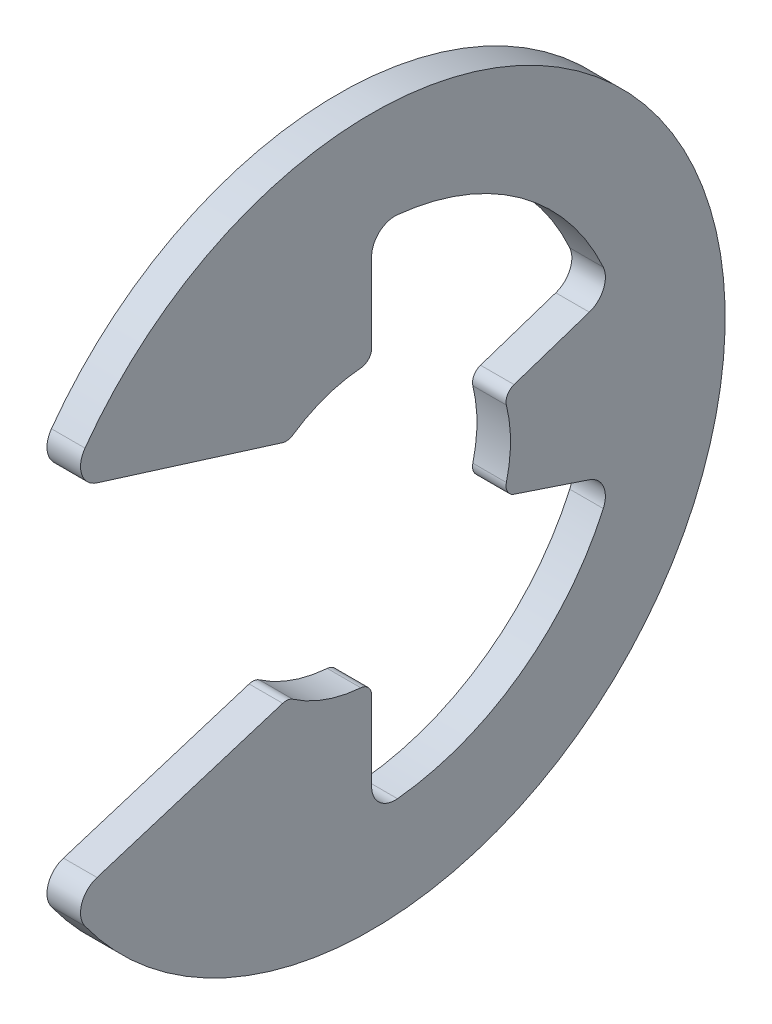
ISO-10303-21;
HEADER;
FILE_DESCRIPTION(('STEP AP214'),'2;1');
FILE_NAME('part.step','',(''),(''),'','','');
FILE_SCHEMA(('AUTOMOTIVE_DESIGN { 1 0 10303 214 1 1 1 1 }'));
ENDSEC;
DATA;
#1=APPLICATION_CONTEXT('core data for automotive mechanical design processes');
#2=APPLICATION_PROTOCOL_DEFINITION('international standard','automotive_design',2000,#1);
#3=PRODUCT_CONTEXT('',#1,'mechanical');
#4=PRODUCT('Part','Part','',(#3));
#5=PRODUCT_RELATED_PRODUCT_CATEGORY('part','',(#4));
#6=PRODUCT_DEFINITION_FORMATION('','',#4);
#7=PRODUCT_DEFINITION_CONTEXT('part definition',#1,'design');
#8=PRODUCT_DEFINITION('design','',#6,#7);
#9=PRODUCT_DEFINITION_SHAPE('','',#8);
#10=(LENGTH_UNIT() NAMED_UNIT(*) SI_UNIT(.MILLI.,.METRE.));
#11=(NAMED_UNIT(*) PLANE_ANGLE_UNIT() SI_UNIT($,.RADIAN.));
#12=(NAMED_UNIT(*) SI_UNIT($,.STERADIAN.) SOLID_ANGLE_UNIT());
#13=UNCERTAINTY_MEASURE_WITH_UNIT(LENGTH_MEASURE(1.E-05),#10,'distance_accuracy_value','');
#14=(GEOMETRIC_REPRESENTATION_CONTEXT(3) GLOBAL_UNCERTAINTY_ASSIGNED_CONTEXT((#13)) GLOBAL_UNIT_ASSIGNED_CONTEXT((#10,
#11,#12)) REPRESENTATION_CONTEXT('',''));
#15=CARTESIAN_POINT('',(0.,0.,0.));
#16=DIRECTION('',(0.,0.,1.));
#17=DIRECTION('',(1.,0.,0.));
#18=AXIS2_PLACEMENT_3D('',#15,#16,#17);
#19=CARTESIAN_POINT('',(0.3175,0.,0.));
#20=DIRECTION('',(-1.,0.,0.));
#21=DIRECTION('',(0.,0.,1.));
#22=AXIS2_PLACEMENT_3D('',#19,#20,#21);
#23=CYLINDRICAL_SURFACE('',#22,2.6289);
#24=CARTESIAN_POINT('',(0.3175,0.,0.));
#25=DIRECTION('',(-1.,0.,0.));
#26=DIRECTION('',(0.,0.,-1.));
#27=AXIS2_PLACEMENT_3D('',#24,#25,#26);
#28=CIRCLE('',#27,2.6289);
#29=CARTESIAN_POINT('',(0.3175,0.634392297731757,-2.55120787521884));
#30=VERTEX_POINT('',#29);
#31=CARTESIAN_POINT('',(0.3175,-0.634392297731756,-2.55120787521884));
#32=VERTEX_POINT('',#31);
#33=EDGE_CURVE('E316',#30,#32,#28,.T.);
#34=ORIENTED_EDGE('',*,*,#33,.F.);
#35=DIRECTION('',(-1.,0.,0.));
#36=VECTOR('',#35,1.);
#37=CARTESIAN_POINT('',(0.3175,0.634392297731757,-2.55120787521884));
#38=LINE('',#37,#36);
#39=CARTESIAN_POINT('',(-0.3175,0.634392297731757,-2.55120787521884));
#40=VERTEX_POINT('',#39);
#41=EDGE_CURVE('E484',#30,#40,#38,.T.);
#42=ORIENTED_EDGE('',*,*,#41,.T.);
#43=CARTESIAN_POINT('',(-0.3175,0.,0.));
#44=DIRECTION('',(-1.,0.,0.));
#45=DIRECTION('',(0.,0.,-1.));
#46=AXIS2_PLACEMENT_3D('',#43,#44,#45);
#47=CIRCLE('',#46,2.6289);
#48=CARTESIAN_POINT('',(-0.3175,-0.634392297731756,-2.55120787521884));
#49=VERTEX_POINT('',#48);
#50=EDGE_CURVE('E550',#40,#49,#47,.T.);
#51=ORIENTED_EDGE('',*,*,#50,.T.);
#52=DIRECTION('',(-1.,0.,0.));
#53=VECTOR('',#52,1.);
#54=CARTESIAN_POINT('',(0.3175,-0.634392297731757,-2.55120787521884));
#55=LINE('',#54,#53);
#56=EDGE_CURVE('E76',#49,#32,#55,.F.);
#57=ORIENTED_EDGE('',*,*,#56,.T.);
#58=EDGE_LOOP('',(#34,#42,#51,#57));
#59=FACE_BOUND('',#58,.T.);
#60=ADVANCED_FACE('F47',(#59),#23,.F.);
#61=CARTESIAN_POINT('',(0.3175,-0.831331174081665,-2.493993522245));
#62=DIRECTION('',(0.,0.948683298050514,-0.316227766016838));
#63=DIRECTION('',(0.,0.316227766016838,0.948683298050514));
#64=AXIS2_PLACEMENT_3D('',#61,#62,#63);
#65=PLANE('',#64);
#66=DIRECTION('',(0.,-0.316227766016838,-0.948683298050514));
#67=VECTOR('',#66,1.);
#68=CARTESIAN_POINT('',(0.3175,-0.831331174081665,-2.493993522245));
#69=LINE('',#68,#67);
#70=CARTESIAN_POINT('',(0.3175,-0.898869359807086,-2.69660807942126));
#71=VERTEX_POINT('',#70);
#72=CARTESIAN_POINT('',(0.3175,-1.37371537804572,-4.12114613413716));
#73=VERTEX_POINT('',#72);
#74=EDGE_CURVE('E325',#71,#73,#69,.T.);
#75=ORIENTED_EDGE('',*,*,#74,.F.);
#76=DIRECTION('',(-1.,0.,0.));
#77=VECTOR('',#76,1.);
#78=CARTESIAN_POINT('',(0.3175,-0.898869359807086,-2.69660807942126));
#79=LINE('',#78,#77);
#80=CARTESIAN_POINT('',(-0.3175,-0.898869359807086,-2.69660807942126));
#81=VERTEX_POINT('',#80);
#82=EDGE_CURVE('E490',#71,#81,#79,.T.);
#83=ORIENTED_EDGE('',*,*,#82,.T.);
#84=DIRECTION('',(0.,-0.316227766016838,-0.948683298050514));
#85=VECTOR('',#84,1.);
#86=CARTESIAN_POINT('',(-0.3175,-0.831331174081665,-2.493993522245));
#87=LINE('',#86,#85);
#88=CARTESIAN_POINT('',(-0.3175,-1.37371537804572,-4.12114613413716));
#89=VERTEX_POINT('',#88);
#90=EDGE_CURVE('E553',#81,#89,#87,.T.);
#91=ORIENTED_EDGE('',*,*,#90,.T.);
#92=DIRECTION('',(1.,0.,0.));
#93=VECTOR('',#92,1.);
#94=CARTESIAN_POINT('',(0.3175,-1.37371537804572,-4.12114613413716));
#95=LINE('',#94,#93);
#96=EDGE_CURVE('E387',#89,#73,#95,.T.);
#97=ORIENTED_EDGE('',*,*,#96,.T.);
#98=EDGE_LOOP('',(#75,#83,#91,#97));
#99=FACE_BOUND('',#98,.T.);
#100=ADVANCED_FACE('F591',(#99),#65,.F.);
#101=CARTESIAN_POINT('',(0.3175,0.,0.));
#102=DIRECTION('',(-1.,0.,0.));
#103=DIRECTION('',(0.,0.,1.));
#104=AXIS2_PLACEMENT_3D('',#101,#102,#103);
#105=CYLINDRICAL_SURFACE('',#104,4.81125161290323);
#106=CARTESIAN_POINT('',(-0.3175,0.,0.));
#107=DIRECTION('',(-1.,0.,0.));
#108=DIRECTION('',(0.,0.,-1.));
#109=AXIS2_PLACEMENT_3D('',#106,#107,#108);
#110=CIRCLE('',#109,4.81125161290323);
#111=CARTESIAN_POINT('',(-0.3175,-1.97816282406592,-4.38577403933986));
#112=VERTEX_POINT('',#111);
#113=CARTESIAN_POINT('',(-0.3175,-4.78626059081718,-0.489746505300684));
#114=VERTEX_POINT('',#113);
#115=EDGE_CURVE('E554',#112,#114,#110,.T.);
#116=ORIENTED_EDGE('',*,*,#115,.T.);
#117=DIRECTION('',(-1.,0.,0.));
#118=VECTOR('',#117,1.);
#119=CARTESIAN_POINT('',(0.3175,-4.78626059081718,-0.489746505300684));
#120=LINE('',#119,#118);
#121=CARTESIAN_POINT('',(0.3175,-4.78626059081718,-0.489746505300684));
#122=VERTEX_POINT('',#121);
#123=EDGE_CURVE('E384',#114,#122,#120,.F.);
#124=ORIENTED_EDGE('',*,*,#123,.T.);
#125=CARTESIAN_POINT('',(0.3175,0.,0.));
#126=DIRECTION('',(-1.,0.,0.));
#127=DIRECTION('',(0.,0.,-1.));
#128=AXIS2_PLACEMENT_3D('',#125,#126,#127);
#129=CIRCLE('',#128,4.81125161290323);
#130=CARTESIAN_POINT('',(0.3175,-1.97816282406592,-4.38577403933986));
#131=VERTEX_POINT('',#130);
#132=EDGE_CURVE('E323',#131,#122,#129,.T.);
#133=ORIENTED_EDGE('',*,*,#132,.F.);
#134=DIRECTION('',(-1.,0.,0.));
#135=VECTOR('',#134,1.);
#136=CARTESIAN_POINT('',(0.3175,-1.97816282406592,-4.38577403933986));
#137=LINE('',#136,#135);
#138=EDGE_CURVE('E378',#131,#112,#137,.T.);
#139=ORIENTED_EDGE('',*,*,#138,.T.);
#140=EDGE_LOOP('',(#116,#124,#133,#139));
#141=FACE_BOUND('',#140,.T.);
#142=ADVANCED_FACE('F596',(#141),#105,.F.);
#143=CARTESIAN_POINT('',(0.3175,-4.81125161290323,0.));
#144=DIRECTION('',(0.,0.,1.));
#145=DIRECTION('',(0.,-1.,0.));
#146=AXIS2_PLACEMENT_3D('',#143,#144,#145);
#147=PLANE('',#146);
#148=DIRECTION('',(0.,1.,0.));
#149=VECTOR('',#148,1.);
#150=CARTESIAN_POINT('',(-0.3175,-4.81125161290323,0.));
#151=LINE('',#150,#149);
#152=CARTESIAN_POINT('',(-0.3175,-4.34406945142374,0.));
#153=VERTEX_POINT('',#152);
#154=CARTESIAN_POINT('',(-0.3175,-2.8424744959278,0.));
#155=VERTEX_POINT('',#154);
#156=EDGE_CURVE('E561',#153,#155,#151,.T.);
#157=ORIENTED_EDGE('',*,*,#156,.T.);
#158=DIRECTION('',(-1.,0.,0.));
#159=VECTOR('',#158,1.);
#160=CARTESIAN_POINT('',(0.3175,-2.8424744959278,0.));
#161=LINE('',#160,#159);
#162=CARTESIAN_POINT('',(0.3175,-2.8424744959278,0.));
#163=VERTEX_POINT('',#162);
#164=EDGE_CURVE('E457',#155,#163,#161,.F.);
#165=ORIENTED_EDGE('',*,*,#164,.T.);
#166=DIRECTION('',(0.,1.,0.));
#167=VECTOR('',#166,1.);
#168=CARTESIAN_POINT('',(0.3175,-4.81125161290323,0.));
#169=LINE('',#168,#167);
#170=CARTESIAN_POINT('',(0.3175,-4.34406945142374,0.));
#171=VERTEX_POINT('',#170);
#172=EDGE_CURVE('E329',#171,#163,#169,.T.);
#173=ORIENTED_EDGE('',*,*,#172,.F.);
#174=DIRECTION('',(1.,0.,0.));
#175=VECTOR('',#174,1.);
#176=CARTESIAN_POINT('',(-0.3175,-4.34406945142374,0.));
#177=LINE('',#176,#175);
#178=EDGE_CURVE('E374',#171,#153,#177,.F.);
#179=ORIENTED_EDGE('',*,*,#178,.T.);
#180=EDGE_LOOP('',(#157,#165,#173,#179));
#181=FACE_BOUND('',#180,.T.);
#182=ADVANCED_FACE('F601',(#181),#147,.F.);
#183=CARTESIAN_POINT('',(0.3175,0.,0.));
#184=DIRECTION('',(-1.,0.,0.));
#185=DIRECTION('',(0.,0.,1.));
#186=AXIS2_PLACEMENT_3D('',#183,#184,#185);
#187=CYLINDRICAL_SURFACE('',#186,2.6289);
#188=CARTESIAN_POINT('',(0.3175,0.,0.));
#189=DIRECTION('',(-1.,0.,0.));
#190=DIRECTION('',(0.,0.,-1.));
#191=AXIS2_PLACEMENT_3D('',#188,#189,#190);
#192=CIRCLE('',#191,2.6289);
#193=CARTESIAN_POINT('',(0.3175,-2.62090076016505,0.204925389755011));
#194=VERTEX_POINT('',#193);
#195=CARTESIAN_POINT('',(0.3175,-2.16527043809185,1.490878646948));
#196=VERTEX_POINT('',#195);
#197=EDGE_CURVE('E331',#194,#196,#192,.T.);
#198=ORIENTED_EDGE('',*,*,#197,.F.);
#199=DIRECTION('',(-1.,0.,0.));
#200=VECTOR('',#199,1.);
#201=CARTESIAN_POINT('',(0.3175,-2.62090076016505,0.204925389755011));
#202=LINE('',#201,#200);
#203=CARTESIAN_POINT('',(-0.3175,-2.62090076016505,0.204925389755011));
#204=VERTEX_POINT('',#203);
#205=EDGE_CURVE('E432',#194,#204,#202,.T.);
#206=ORIENTED_EDGE('',*,*,#205,.T.);
#207=CARTESIAN_POINT('',(-0.3175,0.,0.));
#208=DIRECTION('',(-1.,0.,0.));
#209=DIRECTION('',(0.,0.,-1.));
#210=AXIS2_PLACEMENT_3D('',#207,#208,#209);
#211=CIRCLE('',#210,2.6289);
#212=CARTESIAN_POINT('',(-0.3175,-2.16527043809185,1.490878646948));
#213=VERTEX_POINT('',#212);
#214=EDGE_CURVE('E301',#204,#213,#211,.T.);
#215=ORIENTED_EDGE('',*,*,#214,.T.);
#216=DIRECTION('',(-1.,0.,0.));
#217=VECTOR('',#216,1.);
#218=CARTESIAN_POINT('',(0.3175,-2.16527043809185,1.490878646948));
#219=LINE('',#218,#217);
#220=EDGE_CURVE('E431',#213,#196,#219,.F.);
#221=ORIENTED_EDGE('',*,*,#220,.T.);
#222=EDGE_LOOP('',(#198,#206,#215,#221));
#223=FACE_BOUND('',#222,.T.);
#224=ADVANCED_FACE('F569',(#223),#187,.F.);
#225=CARTESIAN_POINT('',(0.3175,-2.10312,1.57734));
#226=DIRECTION('',(0.,-0.954513538836349,-0.29816757734219));
#227=DIRECTION('',(0.,0.29816757734219,-0.954513538836349));
#228=AXIS2_PLACEMENT_3D('',#225,#226,#227);
#229=PLANE('',#228);
#230=DIRECTION('',(0.,-0.29816757734219,0.954513538836348));
#231=VECTOR('',#230,1.);
#232=CARTESIAN_POINT('',(0.3175,-2.10312,1.57734));
#233=LINE('',#232,#231);
#234=CARTESIAN_POINT('',(0.3175,-2.13618406817537,1.683186856334));
#235=VERTEX_POINT('',#234);
#236=CARTESIAN_POINT('',(0.3175,-3.2341191064352,5.19796826926775));
#237=VERTEX_POINT('',#236);
#238=EDGE_CURVE('E340',#235,#237,#233,.T.);
#239=ORIENTED_EDGE('',*,*,#238,.F.);
#240=DIRECTION('',(-1.,0.,0.));
#241=VECTOR('',#240,1.);
#242=CARTESIAN_POINT('',(0.3175,-2.13618406817537,1.683186856334));
#243=LINE('',#242,#241);
#244=CARTESIAN_POINT('',(-0.3175,-2.13618406817537,1.683186856334));
#245=VERTEX_POINT('',#244);
#246=EDGE_CURVE('E477',#235,#245,#243,.T.);
#247=ORIENTED_EDGE('',*,*,#246,.T.);
#248=DIRECTION('',(0.,-0.29816757734219,0.954513538836348));
#249=VECTOR('',#248,1.);
#250=CARTESIAN_POINT('',(-0.3175,-2.10312,1.57734));
#251=LINE('',#250,#249);
#252=CARTESIAN_POINT('',(-0.3175,-3.2341191064352,5.19796826926775));
#253=VERTEX_POINT('',#252);
#254=EDGE_CURVE('E293',#245,#253,#251,.T.);
#255=ORIENTED_EDGE('',*,*,#254,.T.);
#256=DIRECTION('',(-1.,0.,0.));
#257=VECTOR('',#256,1.);
#258=CARTESIAN_POINT('',(0.3175,-3.2341191064352,5.19796826926775));
#259=LINE('',#258,#257);
#260=EDGE_CURVE('E266',#253,#237,#259,.F.);
#261=ORIENTED_EDGE('',*,*,#260,.T.);
#262=EDGE_LOOP('',(#239,#247,#255,#261));
#263=FACE_BOUND('',#262,.T.);
#264=ADVANCED_FACE('F579',(#263),#229,.F.);
#265=CARTESIAN_POINT('',(0.3175,0.,0.));
#266=DIRECTION('',(-1.,0.,0.));
#267=DIRECTION('',(0.,0.,1.));
#268=AXIS2_PLACEMENT_3D('',#265,#266,#267);
#269=CYLINDRICAL_SURFACE('',#268,6.6929);
#270=CARTESIAN_POINT('',(0.3175,0.,0.));
#271=DIRECTION('',(1.,0.,0.));
#272=DIRECTION('',(0.,0.,-1.));
#273=AXIS2_PLACEMENT_3D('',#270,#271,#272);
#274=CIRCLE('',#273,6.6929);
#275=CARTESIAN_POINT('',(0.3175,-3.91865243360584,5.42577860906571));
#276=VERTEX_POINT('',#275);
#277=CARTESIAN_POINT('',(0.3175,3.91865243360584,5.42577860906571));
#278=VERTEX_POINT('',#277);
#279=EDGE_CURVE('E285',#276,#278,#274,.T.);
#280=ORIENTED_EDGE('',*,*,#279,.F.);
#281=DIRECTION('',(-1.,0.,0.));
#282=VECTOR('',#281,1.);
#283=CARTESIAN_POINT('',(0.3175,-3.91865243360584,5.42577860906571));
#284=LINE('',#283,#282);
#285=CARTESIAN_POINT('',(-0.3175,-3.91865243360584,5.42577860906571));
#286=VERTEX_POINT('',#285);
#287=EDGE_CURVE('E268',#276,#286,#284,.T.);
#288=ORIENTED_EDGE('',*,*,#287,.T.);
#289=CARTESIAN_POINT('',(-0.3175,0.,0.));
#290=DIRECTION('',(1.,0.,0.));
#291=DIRECTION('',(0.,0.,-1.));
#292=AXIS2_PLACEMENT_3D('',#289,#290,#291);
#293=CIRCLE('',#292,6.6929);
#294=CARTESIAN_POINT('',(-0.3175,3.91865243360584,5.42577860906571));
#295=VERTEX_POINT('',#294);
#296=EDGE_CURVE('E276',#286,#295,#293,.T.);
#297=ORIENTED_EDGE('',*,*,#296,.T.);
#298=DIRECTION('',(-1.,0.,0.));
#299=VECTOR('',#298,1.);
#300=CARTESIAN_POINT('',(0.3175,3.91865243360584,5.42577860906571));
#301=LINE('',#300,#299);
#302=EDGE_CURVE('E284',#295,#278,#301,.F.);
#303=ORIENTED_EDGE('',*,*,#302,.T.);
#304=EDGE_LOOP('',(#280,#288,#297,#303));
#305=FACE_BOUND('',#304,.T.);
#306=ADVANCED_FACE('F279',(#305),#269,.T.);
#307=CARTESIAN_POINT('',(0.3175,3.40948689870738,5.75936710911388));
#308=DIRECTION('',(0.,0.954513538836349,-0.298167577342189));
#309=DIRECTION('',(0.,0.298167577342189,0.954513538836349));
#310=AXIS2_PLACEMENT_3D('',#307,#308,#309);
#311=PLANE('',#310);
#312=DIRECTION('',(0.,-0.298167577342189,-0.954513538836349));
#313=VECTOR('',#312,1.);
#314=CARTESIAN_POINT('',(-0.3175,3.40948689870738,5.75936710911388));
#315=LINE('',#314,#313);
#316=CARTESIAN_POINT('',(-0.3175,3.2341191064352,5.19796826926775));
#317=VERTEX_POINT('',#316);
#318=CARTESIAN_POINT('',(-0.3175,2.13618406817537,1.683186856334));
#319=VERTEX_POINT('',#318);
#320=EDGE_CURVE('E288',#317,#319,#315,.T.);
#321=ORIENTED_EDGE('',*,*,#320,.T.);
#322=DIRECTION('',(-1.,0.,0.));
#323=VECTOR('',#322,1.);
#324=CARTESIAN_POINT('',(0.3175,2.13618406817537,1.683186856334));
#325=LINE('',#324,#323);
#326=CARTESIAN_POINT('',(0.3175,2.13618406817537,1.683186856334));
#327=VERTEX_POINT('',#326);
#328=EDGE_CURVE('E59',#319,#327,#325,.F.);
#329=ORIENTED_EDGE('',*,*,#328,.T.);
#330=DIRECTION('',(0.,-0.298167577342189,-0.954513538836349));
#331=VECTOR('',#330,1.);
#332=CARTESIAN_POINT('',(0.3175,3.40948689870738,5.75936710911388));
#333=LINE('',#332,#331);
#334=CARTESIAN_POINT('',(0.3175,3.2341191064352,5.19796826926775));
#335=VERTEX_POINT('',#334);
#336=EDGE_CURVE('E345',#335,#327,#333,.T.);
#337=ORIENTED_EDGE('',*,*,#336,.F.);
#338=DIRECTION('',(-1.,0.,0.));
#339=VECTOR('',#338,1.);
#340=CARTESIAN_POINT('',(0.3175,3.2341191064352,5.19796826926775));
#341=LINE('',#340,#339);
#342=EDGE_CURVE('E371',#335,#317,#341,.T.);
#343=ORIENTED_EDGE('',*,*,#342,.T.);
#344=EDGE_LOOP('',(#321,#329,#337,#343));
#345=FACE_BOUND('',#344,.T.);
#346=ADVANCED_FACE('F502',(#345),#311,.F.);
#347=CARTESIAN_POINT('',(0.3175,0.,0.));
#348=DIRECTION('',(-1.,0.,0.));
#349=DIRECTION('',(0.,0.,1.));
#350=AXIS2_PLACEMENT_3D('',#347,#348,#349);
#351=CYLINDRICAL_SURFACE('',#350,2.6289);
#352=CARTESIAN_POINT('',(0.3175,0.,0.));
#353=DIRECTION('',(-1.,0.,0.));
#354=DIRECTION('',(0.,0.,-1.));
#355=AXIS2_PLACEMENT_3D('',#352,#353,#354);
#356=CIRCLE('',#355,2.6289);
#357=CARTESIAN_POINT('',(0.3175,2.16527043809185,1.49087864694801));
#358=VERTEX_POINT('',#357);
#359=CARTESIAN_POINT('',(0.3175,2.62090076016505,0.204925389755012));
#360=VERTEX_POINT('',#359);
#361=EDGE_CURVE('E347',#358,#360,#356,.T.);
#362=ORIENTED_EDGE('',*,*,#361,.F.);
#363=DIRECTION('',(-1.,0.,0.));
#364=VECTOR('',#363,1.);
#365=CARTESIAN_POINT('',(0.3175,2.16527043809185,1.49087864694801));
#366=LINE('',#365,#364);
#367=CARTESIAN_POINT('',(-0.3175,2.16527043809185,1.49087864694801));
#368=VERTEX_POINT('',#367);
#369=EDGE_CURVE('E496',#358,#368,#366,.T.);
#370=ORIENTED_EDGE('',*,*,#369,.T.);
#371=CARTESIAN_POINT('',(-0.3175,0.,0.));
#372=DIRECTION('',(-1.,0.,0.));
#373=DIRECTION('',(0.,0.,-1.));
#374=AXIS2_PLACEMENT_3D('',#371,#372,#373);
#375=CIRCLE('',#374,2.6289);
#376=CARTESIAN_POINT('',(-0.3175,2.62090076016505,0.204925389755012));
#377=VERTEX_POINT('',#376);
#378=EDGE_CURVE('E296',#368,#377,#375,.T.);
#379=ORIENTED_EDGE('',*,*,#378,.T.);
#380=DIRECTION('',(-1.,0.,0.));
#381=VECTOR('',#380,1.);
#382=CARTESIAN_POINT('',(0.3175,2.62090076016505,0.204925389755012));
#383=LINE('',#382,#381);
#384=EDGE_CURVE('E491',#377,#360,#383,.F.);
#385=ORIENTED_EDGE('',*,*,#384,.T.);
#386=EDGE_LOOP('',(#362,#370,#379,#385));
#387=FACE_BOUND('',#386,.T.);
#388=ADVANCED_FACE('F513',(#387),#351,.F.);
#389=CARTESIAN_POINT('',(0.3175,2.6289,0.));
#390=DIRECTION('',(0.,0.,1.));
#391=DIRECTION('',(0.,-1.,0.));
#392=AXIS2_PLACEMENT_3D('',#389,#390,#391);
#393=PLANE('',#392);
#394=DIRECTION('',(0.,1.,0.));
#395=VECTOR('',#394,1.);
#396=CARTESIAN_POINT('',(0.3175,2.6289,0.));
#397=LINE('',#396,#395);
#398=CARTESIAN_POINT('',(0.3175,2.8424744959278,0.));
#399=VERTEX_POINT('',#398);
#400=CARTESIAN_POINT('',(0.3175,4.34406945142374,0.));
#401=VERTEX_POINT('',#400);
#402=EDGE_CURVE('E346',#399,#401,#397,.T.);
#403=ORIENTED_EDGE('',*,*,#402,.F.);
#404=DIRECTION('',(-1.,0.,0.));
#405=VECTOR('',#404,1.);
#406=CARTESIAN_POINT('',(0.3175,2.8424744959278,0.));
#407=LINE('',#406,#405);
#408=CARTESIAN_POINT('',(-0.3175,2.8424744959278,0.));
#409=VERTEX_POINT('',#408);
#410=EDGE_CURVE('E11',#399,#409,#407,.T.);
#411=ORIENTED_EDGE('',*,*,#410,.T.);
#412=DIRECTION('',(0.,1.,0.));
#413=VECTOR('',#412,1.);
#414=CARTESIAN_POINT('',(-0.3175,2.6289,0.));
#415=LINE('',#414,#413);
#416=CARTESIAN_POINT('',(-0.3175,4.34406945142374,0.));
#417=VERTEX_POINT('',#416);
#418=EDGE_CURVE('E308',#409,#417,#415,.T.);
#419=ORIENTED_EDGE('',*,*,#418,.T.);
#420=DIRECTION('',(1.,0.,0.));
#421=VECTOR('',#420,1.);
#422=CARTESIAN_POINT('',(0.3175,4.34406945142374,0.));
#423=LINE('',#422,#421);
#424=EDGE_CURVE('E402',#417,#401,#423,.T.);
#425=ORIENTED_EDGE('',*,*,#424,.T.);
#426=EDGE_LOOP('',(#403,#411,#419,#425));
#427=FACE_BOUND('',#426,.T.);
#428=ADVANCED_FACE('F523',(#427),#393,.F.);
#429=CARTESIAN_POINT('',(0.3175,0.,0.));
#430=DIRECTION('',(-1.,0.,0.));
#431=DIRECTION('',(0.,0.,1.));
#432=AXIS2_PLACEMENT_3D('',#429,#430,#431);
#433=CYLINDRICAL_SURFACE('',#432,4.81125161290323);
#434=CARTESIAN_POINT('',(-0.3175,0.,0.));
#435=DIRECTION('',(-1.,0.,0.));
#436=DIRECTION('',(0.,0.,-1.));
#437=AXIS2_PLACEMENT_3D('',#434,#435,#436);
#438=CIRCLE('',#437,4.81125161290323);
#439=CARTESIAN_POINT('',(-0.3175,4.78626059081718,-0.489746505300684));
#440=VERTEX_POINT('',#439);
#441=CARTESIAN_POINT('',(-0.3175,1.97816282406592,-4.38577403933986));
#442=VERTEX_POINT('',#441);
#443=EDGE_CURVE('E311',#440,#442,#438,.T.);
#444=ORIENTED_EDGE('',*,*,#443,.T.);
#445=DIRECTION('',(-1.,0.,0.));
#446=VECTOR('',#445,1.);
#447=CARTESIAN_POINT('',(0.3175,1.97816282406592,-4.38577403933986));
#448=LINE('',#447,#446);
#449=CARTESIAN_POINT('',(0.3175,1.97816282406592,-4.38577403933986));
#450=VERTEX_POINT('',#449);
#451=EDGE_CURVE('E396',#442,#450,#448,.F.);
#452=ORIENTED_EDGE('',*,*,#451,.T.);
#453=CARTESIAN_POINT('',(0.3175,0.,0.));
#454=DIRECTION('',(-1.,0.,0.));
#455=DIRECTION('',(0.,0.,-1.));
#456=AXIS2_PLACEMENT_3D('',#453,#454,#455);
#457=CIRCLE('',#456,4.81125161290323);
#458=CARTESIAN_POINT('',(0.3175,4.78626059081718,-0.489746505300684));
#459=VERTEX_POINT('',#458);
#460=EDGE_CURVE('E355',#459,#450,#457,.T.);
#461=ORIENTED_EDGE('',*,*,#460,.F.);
#462=DIRECTION('',(-1.,0.,0.));
#463=VECTOR('',#462,1.);
#464=CARTESIAN_POINT('',(0.3175,4.78626059081718,-0.489746505300684));
#465=LINE('',#464,#463);
#466=EDGE_CURVE('E394',#459,#440,#465,.T.);
#467=ORIENTED_EDGE('',*,*,#466,.T.);
#468=EDGE_LOOP('',(#444,#452,#461,#467));
#469=FACE_BOUND('',#468,.T.);
#470=ADVANCED_FACE('F532',(#469),#433,.F.);
#471=CARTESIAN_POINT('',(0.3175,1.5214513492933,-4.56435404787989));
#472=DIRECTION('',(0.,-0.948683298050514,-0.316227766016838));
#473=DIRECTION('',(0.,0.316227766016838,-0.948683298050514));
#474=AXIS2_PLACEMENT_3D('',#471,#472,#473);
#475=PLANE('',#474);
#476=DIRECTION('',(0.,-0.316227766016838,0.948683298050514));
#477=VECTOR('',#476,1.);
#478=CARTESIAN_POINT('',(-0.3175,1.5214513492933,-4.56435404787989));
#479=LINE('',#478,#477);
#480=CARTESIAN_POINT('',(-0.3175,1.37371537804572,-4.12114613413716));
#481=VERTEX_POINT('',#480);
#482=CARTESIAN_POINT('',(-0.3175,0.898869359807086,-2.69660807942126));
#483=VERTEX_POINT('',#482);
#484=EDGE_CURVE('E314',#481,#483,#479,.T.);
#485=ORIENTED_EDGE('',*,*,#484,.T.);
#486=DIRECTION('',(-1.,0.,0.));
#487=VECTOR('',#486,1.);
#488=CARTESIAN_POINT('',(0.3175,0.898869359807086,-2.69660807942126));
#489=LINE('',#488,#487);
#490=CARTESIAN_POINT('',(0.3175,0.898869359807086,-2.69660807942126));
#491=VERTEX_POINT('',#490);
#492=EDGE_CURVE('E488',#483,#491,#489,.F.);
#493=ORIENTED_EDGE('',*,*,#492,.T.);
#494=DIRECTION('',(0.,-0.316227766016838,0.948683298050514));
#495=VECTOR('',#494,1.);
#496=CARTESIAN_POINT('',(0.3175,1.5214513492933,-4.56435404787989));
#497=LINE('',#496,#495);
#498=CARTESIAN_POINT('',(0.3175,1.37371537804572,-4.12114613413716));
#499=VERTEX_POINT('',#498);
#500=EDGE_CURVE('E357',#499,#491,#497,.T.);
#501=ORIENTED_EDGE('',*,*,#500,.F.);
#502=DIRECTION('',(1.,0.,0.));
#503=VECTOR('',#502,1.);
#504=CARTESIAN_POINT('',(-0.3175,1.37371537804572,-4.12114613413716));
#505=LINE('',#504,#503);
#506=EDGE_CURVE('E388',#499,#481,#505,.F.);
#507=ORIENTED_EDGE('',*,*,#506,.T.);
#508=EDGE_LOOP('',(#485,#493,#501,#507));
#509=FACE_BOUND('',#508,.T.);
#510=ADVANCED_FACE('F545',(#509),#475,.F.);
#511=CARTESIAN_POINT('',(0.3175,0.,0.));
#512=DIRECTION('',(1.,0.,0.));
#513=DIRECTION('',(0.,0.,-1.));
#514=AXIS2_PLACEMENT_3D('',#511,#512,#513);
#515=PLANE('',#514);
#516=ORIENTED_EDGE('',*,*,#172,.T.);
#517=CARTESIAN_POINT('',(0.3175,-2.8424744959278,0.22225));
#518=DIRECTION('',(1.,0.,0.));
#519=DIRECTION('',(0.,0.,-1.));
#520=AXIS2_PLACEMENT_3D('',#517,#518,#519);
#521=CIRCLE('',#520,0.22225);
#522=EDGE_CURVE('E474',#163,#194,#521,.T.);
#523=ORIENTED_EDGE('',*,*,#522,.T.);
#524=ORIENTED_EDGE('',*,*,#197,.T.);
#525=CARTESIAN_POINT('',(0.3175,-2.34832470218174,1.6169191122697));
#526=DIRECTION('',(1.,0.,0.));
#527=DIRECTION('',(0.,0.,-1.));
#528=AXIS2_PLACEMENT_3D('',#525,#526,#527);
#529=CIRCLE('',#528,0.22225);
#530=EDGE_CURVE('E468',#196,#235,#529,.T.);
#531=ORIENTED_EDGE('',*,*,#530,.T.);
#532=ORIENTED_EDGE('',*,*,#238,.T.);
#533=CARTESIAN_POINT('',(0.3175,-3.65840037444796,5.06543278113915));
#534=DIRECTION('',(1.,0.,0.));
#535=DIRECTION('',(0.,0.,-1.));
#536=AXIS2_PLACEMENT_3D('',#533,#534,#535);
#537=CIRCLE('',#536,0.4445);
#538=EDGE_CURVE('E368',#237,#276,#537,.T.);
#539=ORIENTED_EDGE('',*,*,#538,.T.);
#540=ORIENTED_EDGE('',*,*,#279,.T.);
#541=CARTESIAN_POINT('',(0.3175,3.65840037444795,5.06543278113915));
#542=DIRECTION('',(1.,0.,0.));
#543=DIRECTION('',(0.,0.,-1.));
#544=AXIS2_PLACEMENT_3D('',#541,#542,#543);
#545=CIRCLE('',#544,0.4445);
#546=EDGE_CURVE('E362',#278,#335,#545,.T.);
#547=ORIENTED_EDGE('',*,*,#546,.T.);
#548=ORIENTED_EDGE('',*,*,#336,.T.);
#549=CARTESIAN_POINT('',(0.3175,2.34832470218174,1.6169191122697));
#550=DIRECTION('',(1.,0.,0.));
#551=DIRECTION('',(0.,0.,-1.));
#552=AXIS2_PLACEMENT_3D('',#549,#550,#551);
#553=CIRCLE('',#552,0.22225);
#554=EDGE_CURVE('E465',#327,#358,#553,.T.);
#555=ORIENTED_EDGE('',*,*,#554,.T.);
#556=ORIENTED_EDGE('',*,*,#361,.T.);
#557=CARTESIAN_POINT('',(0.3175,2.8424744959278,0.222250000000001));
#558=DIRECTION('',(1.,0.,0.));
#559=DIRECTION('',(0.,0.,-1.));
#560=AXIS2_PLACEMENT_3D('',#557,#558,#559);
#561=CIRCLE('',#560,0.22225);
#562=EDGE_CURVE('E459',#360,#399,#561,.T.);
#563=ORIENTED_EDGE('',*,*,#562,.T.);
#564=ORIENTED_EDGE('',*,*,#402,.T.);
#565=CARTESIAN_POINT('',(0.3175,4.34406945142374,-0.444499999999999));
#566=DIRECTION('',(1.,0.,0.));
#567=DIRECTION('',(0.,0.,-1.));
#568=AXIS2_PLACEMENT_3D('',#565,#566,#567);
#569=CIRCLE('',#568,0.4445);
#570=EDGE_CURVE('E426',#401,#459,#569,.F.);
#571=ORIENTED_EDGE('',*,*,#570,.T.);
#572=ORIENTED_EDGE('',*,*,#460,.T.);
#573=CARTESIAN_POINT('',(0.3175,1.79540510402917,-3.98058289214267));
#574=DIRECTION('',(1.,0.,0.));
#575=DIRECTION('',(0.,0.,-1.));
#576=AXIS2_PLACEMENT_3D('',#573,#574,#575);
#577=CIRCLE('',#576,0.4445);
#578=EDGE_CURVE('E423',#450,#499,#577,.F.);
#579=ORIENTED_EDGE('',*,*,#578,.T.);
#580=ORIENTED_EDGE('',*,*,#500,.T.);
#581=CARTESIAN_POINT('',(0.3175,0.68802449681536,-2.7668897004185));
#582=DIRECTION('',(1.,0.,0.));
#583=DIRECTION('',(0.,0.,-1.));
#584=AXIS2_PLACEMENT_3D('',#581,#582,#583);
#585=CIRCLE('',#584,0.22225);
#586=EDGE_CURVE('E470',#491,#30,#585,.T.);
#587=ORIENTED_EDGE('',*,*,#586,.T.);
#588=ORIENTED_EDGE('',*,*,#33,.T.);
#589=CARTESIAN_POINT('',(0.3175,-0.688024496815359,-2.7668897004185));
#590=DIRECTION('',(1.,0.,0.));
#591=DIRECTION('',(0.,0.,-1.));
#592=AXIS2_PLACEMENT_3D('',#589,#590,#591);
#593=CIRCLE('',#592,0.22225);
#594=EDGE_CURVE('E68',#32,#71,#593,.T.);
#595=ORIENTED_EDGE('',*,*,#594,.T.);
#596=ORIENTED_EDGE('',*,*,#74,.T.);
#597=CARTESIAN_POINT('',(0.3175,-1.79540510402917,-3.98058289214267));
#598=DIRECTION('',(1.,0.,0.));
#599=DIRECTION('',(0.,0.,-1.));
#600=AXIS2_PLACEMENT_3D('',#597,#598,#599);
#601=CIRCLE('',#600,0.4445);
#602=EDGE_CURVE('E411',#73,#131,#601,.F.);
#603=ORIENTED_EDGE('',*,*,#602,.T.);
#604=ORIENTED_EDGE('',*,*,#132,.T.);
#605=CARTESIAN_POINT('',(0.3175,-4.34406945142374,-0.444499999999999));
#606=DIRECTION('',(1.,0.,0.));
#607=DIRECTION('',(0.,0.,-1.));
#608=AXIS2_PLACEMENT_3D('',#605,#606,#607);
#609=CIRCLE('',#608,0.4445);
#610=EDGE_CURVE('E409',#122,#171,#609,.F.);
#611=ORIENTED_EDGE('',*,*,#610,.T.);
#612=EDGE_LOOP('',(#516,#523,#524,#531,#532,#539,#540,#547,#548,#555,#556,#563,#564,#571,#572,
#579,#580,#587,#588,#595,#596,#603,#604,#611));
#613=FACE_BOUND('',#612,.T.);
#614=ADVANCED_FACE('F507',(#613),#515,.T.);
#615=CARTESIAN_POINT('',(-0.3175,0.,0.));
#616=DIRECTION('',(1.,0.,0.));
#617=DIRECTION('',(0.,0.,-1.));
#618=AXIS2_PLACEMENT_3D('',#615,#616,#617);
#619=PLANE('',#618);
#620=ORIENTED_EDGE('',*,*,#214,.F.);
#621=CARTESIAN_POINT('',(-0.3175,-2.8424744959278,0.22225));
#622=DIRECTION('',(1.,0.,0.));
#623=DIRECTION('',(0.,0.,-1.));
#624=AXIS2_PLACEMENT_3D('',#621,#622,#623);
#625=CIRCLE('',#624,0.22225);
#626=EDGE_CURVE('E454',#204,#155,#625,.F.);
#627=ORIENTED_EDGE('',*,*,#626,.T.);
#628=ORIENTED_EDGE('',*,*,#156,.F.);
#629=CARTESIAN_POINT('',(-0.3175,-4.34406945142374,-0.444499999999999));
#630=DIRECTION('',(1.,0.,0.));
#631=DIRECTION('',(0.,0.,-1.));
#632=AXIS2_PLACEMENT_3D('',#629,#630,#631);
#633=CIRCLE('',#632,0.4445);
#634=EDGE_CURVE('E403',#153,#114,#633,.T.);
#635=ORIENTED_EDGE('',*,*,#634,.T.);
#636=ORIENTED_EDGE('',*,*,#115,.F.);
#637=CARTESIAN_POINT('',(-0.3175,-1.79540510402917,-3.98058289214267));
#638=DIRECTION('',(1.,0.,0.));
#639=DIRECTION('',(0.,0.,-1.));
#640=AXIS2_PLACEMENT_3D('',#637,#638,#639);
#641=CIRCLE('',#640,0.4445);
#642=EDGE_CURVE('E412',#112,#89,#641,.T.);
#643=ORIENTED_EDGE('',*,*,#642,.T.);
#644=ORIENTED_EDGE('',*,*,#90,.F.);
#645=CARTESIAN_POINT('',(-0.3175,-0.688024496815359,-2.7668897004185));
#646=DIRECTION('',(1.,0.,0.));
#647=DIRECTION('',(0.,0.,-1.));
#648=AXIS2_PLACEMENT_3D('',#645,#646,#647);
#649=CIRCLE('',#648,0.22225);
#650=EDGE_CURVE('E443',#81,#49,#649,.F.);
#651=ORIENTED_EDGE('',*,*,#650,.T.);
#652=ORIENTED_EDGE('',*,*,#50,.F.);
#653=CARTESIAN_POINT('',(-0.3175,0.68802449681536,-2.7668897004185));
#654=DIRECTION('',(1.,0.,0.));
#655=DIRECTION('',(0.,0.,-1.));
#656=AXIS2_PLACEMENT_3D('',#653,#654,#655);
#657=CIRCLE('',#656,0.22225);
#658=EDGE_CURVE('E450',#40,#483,#657,.F.);
#659=ORIENTED_EDGE('',*,*,#658,.T.);
#660=ORIENTED_EDGE('',*,*,#484,.F.);
#661=CARTESIAN_POINT('',(-0.3175,1.79540510402917,-3.98058289214267));
#662=DIRECTION('',(1.,0.,0.));
#663=DIRECTION('',(0.,0.,-1.));
#664=AXIS2_PLACEMENT_3D('',#661,#662,#663);
#665=CIRCLE('',#664,0.4445);
#666=EDGE_CURVE('E420',#481,#442,#665,.T.);
#667=ORIENTED_EDGE('',*,*,#666,.T.);
#668=ORIENTED_EDGE('',*,*,#443,.F.);
#669=CARTESIAN_POINT('',(-0.3175,4.34406945142374,-0.444499999999999));
#670=DIRECTION('',(1.,0.,0.));
#671=DIRECTION('',(0.,0.,-1.));
#672=AXIS2_PLACEMENT_3D('',#669,#670,#671);
#673=CIRCLE('',#672,0.4445);
#674=EDGE_CURVE('E425',#440,#417,#673,.T.);
#675=ORIENTED_EDGE('',*,*,#674,.T.);
#676=ORIENTED_EDGE('',*,*,#418,.F.);
#677=CARTESIAN_POINT('',(-0.3175,2.8424744959278,0.222250000000001));
#678=DIRECTION('',(1.,0.,0.));
#679=DIRECTION('',(0.,0.,-1.));
#680=AXIS2_PLACEMENT_3D('',#677,#678,#679);
#681=CIRCLE('',#680,0.22225);
#682=EDGE_CURVE('E438',#409,#377,#681,.F.);
#683=ORIENTED_EDGE('',*,*,#682,.T.);
#684=ORIENTED_EDGE('',*,*,#378,.F.);
#685=CARTESIAN_POINT('',(-0.3175,2.34832470218174,1.6169191122697));
#686=DIRECTION('',(1.,0.,0.));
#687=DIRECTION('',(0.,0.,-1.));
#688=AXIS2_PLACEMENT_3D('',#685,#686,#687);
#689=CIRCLE('',#688,0.22225);
#690=EDGE_CURVE('E441',#368,#319,#689,.F.);
#691=ORIENTED_EDGE('',*,*,#690,.T.);
#692=ORIENTED_EDGE('',*,*,#320,.F.);
#693=CARTESIAN_POINT('',(-0.3175,3.65840037444795,5.06543278113915));
#694=DIRECTION('',(1.,0.,0.));
#695=DIRECTION('',(0.,0.,-1.));
#696=AXIS2_PLACEMENT_3D('',#693,#694,#695);
#697=CIRCLE('',#696,0.4445);
#698=EDGE_CURVE('E271',#317,#295,#697,.F.);
#699=ORIENTED_EDGE('',*,*,#698,.T.);
#700=ORIENTED_EDGE('',*,*,#296,.F.);
#701=CARTESIAN_POINT('',(-0.3175,-3.65840037444796,5.06543278113915));
#702=DIRECTION('',(1.,0.,0.));
#703=DIRECTION('',(0.,0.,-1.));
#704=AXIS2_PLACEMENT_3D('',#701,#702,#703);
#705=CIRCLE('',#704,0.4445);
#706=EDGE_CURVE('E265',#286,#253,#705,.F.);
#707=ORIENTED_EDGE('',*,*,#706,.T.);
#708=ORIENTED_EDGE('',*,*,#254,.F.);
#709=CARTESIAN_POINT('',(-0.3175,-2.34832470218174,1.6169191122697));
#710=DIRECTION('',(1.,0.,0.));
#711=DIRECTION('',(0.,0.,-1.));
#712=AXIS2_PLACEMENT_3D('',#709,#710,#711);
#713=CIRCLE('',#712,0.22225);
#714=EDGE_CURVE('E448',#245,#213,#713,.F.);
#715=ORIENTED_EDGE('',*,*,#714,.T.);
#716=EDGE_LOOP('',(#620,#627,#628,#635,#636,#643,#644,#651,#652,#659,#660,#667,#668,#675,#676,
#683,#684,#691,#692,#699,#700,#707,#708,#715));
#717=FACE_BOUND('',#716,.T.);
#718=ADVANCED_FACE('F289',(#717),#619,.F.);
#719=CARTESIAN_POINT('',(0.3175,-3.65840037444796,5.06543278113915));
#720=DIRECTION('',(-1.,0.,0.));
#721=DIRECTION('',(0.,0.,1.));
#722=AXIS2_PLACEMENT_3D('',#719,#720,#721);
#723=CYLINDRICAL_SURFACE('',#722,0.4445);
#724=ORIENTED_EDGE('',*,*,#538,.F.);
#725=ORIENTED_EDGE('',*,*,#260,.F.);
#726=ORIENTED_EDGE('',*,*,#706,.F.);
#727=ORIENTED_EDGE('',*,*,#287,.F.);
#728=EDGE_LOOP('',(#724,#725,#726,#727));
#729=FACE_BOUND('',#728,.T.);
#730=ADVANCED_FACE('F261',(#729),#723,.T.);
#731=CARTESIAN_POINT('',(0.3175,3.65840037444795,5.06543278113915));
#732=DIRECTION('',(-1.,0.,0.));
#733=DIRECTION('',(0.,0.,1.));
#734=AXIS2_PLACEMENT_3D('',#731,#732,#733);
#735=CYLINDRICAL_SURFACE('',#734,0.4445);
#736=ORIENTED_EDGE('',*,*,#546,.F.);
#737=ORIENTED_EDGE('',*,*,#302,.F.);
#738=ORIENTED_EDGE('',*,*,#698,.F.);
#739=ORIENTED_EDGE('',*,*,#342,.F.);
#740=EDGE_LOOP('',(#736,#737,#738,#739));
#741=FACE_BOUND('',#740,.T.);
#742=ADVANCED_FACE('F578',(#741),#735,.T.);
#743=CARTESIAN_POINT('',(0.3175,-4.34406945142374,-0.444499999999999));
#744=DIRECTION('',(-1.,0.,0.));
#745=DIRECTION('',(0.,0.,1.));
#746=AXIS2_PLACEMENT_3D('',#743,#744,#745);
#747=CYLINDRICAL_SURFACE('',#746,0.4445);
#748=ORIENTED_EDGE('',*,*,#610,.F.);
#749=ORIENTED_EDGE('',*,*,#123,.F.);
#750=ORIENTED_EDGE('',*,*,#634,.F.);
#751=ORIENTED_EDGE('',*,*,#178,.F.);
#752=EDGE_LOOP('',(#748,#749,#750,#751));
#753=FACE_BOUND('',#752,.T.);
#754=ADVANCED_FACE('F585',(#753),#747,.F.);
#755=CARTESIAN_POINT('',(0.3175,-1.79540510402917,-3.98058289214267));
#756=DIRECTION('',(-1.,0.,0.));
#757=DIRECTION('',(0.,0.,1.));
#758=AXIS2_PLACEMENT_3D('',#755,#756,#757);
#759=CYLINDRICAL_SURFACE('',#758,0.4445);
#760=ORIENTED_EDGE('',*,*,#602,.F.);
#761=ORIENTED_EDGE('',*,*,#96,.F.);
#762=ORIENTED_EDGE('',*,*,#642,.F.);
#763=ORIENTED_EDGE('',*,*,#138,.F.);
#764=EDGE_LOOP('',(#760,#761,#762,#763));
#765=FACE_BOUND('',#764,.T.);
#766=ADVANCED_FACE('F588',(#765),#759,.F.);
#767=CARTESIAN_POINT('',(0.3175,1.79540510402917,-3.98058289214267));
#768=DIRECTION('',(-1.,0.,0.));
#769=DIRECTION('',(0.,0.,1.));
#770=AXIS2_PLACEMENT_3D('',#767,#768,#769);
#771=CYLINDRICAL_SURFACE('',#770,0.4445);
#772=ORIENTED_EDGE('',*,*,#578,.F.);
#773=ORIENTED_EDGE('',*,*,#451,.F.);
#774=ORIENTED_EDGE('',*,*,#666,.F.);
#775=ORIENTED_EDGE('',*,*,#506,.F.);
#776=EDGE_LOOP('',(#772,#773,#774,#775));
#777=FACE_BOUND('',#776,.T.);
#778=ADVANCED_FACE('F540',(#777),#771,.F.);
#779=CARTESIAN_POINT('',(0.3175,4.34406945142374,-0.444499999999999));
#780=DIRECTION('',(-1.,0.,0.));
#781=DIRECTION('',(0.,0.,1.));
#782=AXIS2_PLACEMENT_3D('',#779,#780,#781);
#783=CYLINDRICAL_SURFACE('',#782,0.4445);
#784=ORIENTED_EDGE('',*,*,#570,.F.);
#785=ORIENTED_EDGE('',*,*,#424,.F.);
#786=ORIENTED_EDGE('',*,*,#674,.F.);
#787=ORIENTED_EDGE('',*,*,#466,.F.);
#788=EDGE_LOOP('',(#784,#785,#786,#787));
#789=FACE_BOUND('',#788,.T.);
#790=ADVANCED_FACE('F534',(#789),#783,.F.);
#791=CARTESIAN_POINT('',(0.3175,-2.8424744959278,0.22225));
#792=DIRECTION('',(-1.,0.,0.));
#793=DIRECTION('',(0.,0.,1.));
#794=AXIS2_PLACEMENT_3D('',#791,#792,#793);
#795=CYLINDRICAL_SURFACE('',#794,0.22225);
#796=ORIENTED_EDGE('',*,*,#522,.F.);
#797=ORIENTED_EDGE('',*,*,#164,.F.);
#798=ORIENTED_EDGE('',*,*,#626,.F.);
#799=ORIENTED_EDGE('',*,*,#205,.F.);
#800=EDGE_LOOP('',(#796,#797,#798,#799));
#801=FACE_BOUND('',#800,.T.);
#802=ADVANCED_FACE('F683',(#801),#795,.T.);
#803=CARTESIAN_POINT('',(0.3175,-2.34832470218174,1.6169191122697));
#804=DIRECTION('',(-1.,0.,0.));
#805=DIRECTION('',(0.,0.,1.));
#806=AXIS2_PLACEMENT_3D('',#803,#804,#805);
#807=CYLINDRICAL_SURFACE('',#806,0.22225);
#808=ORIENTED_EDGE('',*,*,#530,.F.);
#809=ORIENTED_EDGE('',*,*,#220,.F.);
#810=ORIENTED_EDGE('',*,*,#714,.F.);
#811=ORIENTED_EDGE('',*,*,#246,.F.);
#812=EDGE_LOOP('',(#808,#809,#810,#811));
#813=FACE_BOUND('',#812,.T.);
#814=ADVANCED_FACE('F573',(#813),#807,.T.);
#815=CARTESIAN_POINT('',(0.3175,0.68802449681536,-2.7668897004185));
#816=DIRECTION('',(-1.,0.,0.));
#817=DIRECTION('',(0.,0.,1.));
#818=AXIS2_PLACEMENT_3D('',#815,#816,#817);
#819=CYLINDRICAL_SURFACE('',#818,0.22225);
#820=ORIENTED_EDGE('',*,*,#586,.F.);
#821=ORIENTED_EDGE('',*,*,#492,.F.);
#822=ORIENTED_EDGE('',*,*,#658,.F.);
#823=ORIENTED_EDGE('',*,*,#41,.F.);
#824=EDGE_LOOP('',(#820,#821,#822,#823));
#825=FACE_BOUND('',#824,.T.);
#826=ADVANCED_FACE('F541',(#825),#819,.T.);
#827=CARTESIAN_POINT('',(0.3175,-0.688024496815359,-2.7668897004185));
#828=DIRECTION('',(-1.,0.,0.));
#829=DIRECTION('',(0.,0.,1.));
#830=AXIS2_PLACEMENT_3D('',#827,#828,#829);
#831=CYLINDRICAL_SURFACE('',#830,0.22225);
#832=ORIENTED_EDGE('',*,*,#594,.F.);
#833=ORIENTED_EDGE('',*,*,#56,.F.);
#834=ORIENTED_EDGE('',*,*,#650,.F.);
#835=ORIENTED_EDGE('',*,*,#82,.F.);
#836=EDGE_LOOP('',(#832,#833,#834,#835));
#837=FACE_BOUND('',#836,.T.);
#838=ADVANCED_FACE('F639',(#837),#831,.T.);
#839=CARTESIAN_POINT('',(0.3175,2.34832470218174,1.6169191122697));
#840=DIRECTION('',(-1.,0.,0.));
#841=DIRECTION('',(0.,0.,1.));
#842=AXIS2_PLACEMENT_3D('',#839,#840,#841);
#843=CYLINDRICAL_SURFACE('',#842,0.22225);
#844=ORIENTED_EDGE('',*,*,#554,.F.);
#845=ORIENTED_EDGE('',*,*,#328,.F.);
#846=ORIENTED_EDGE('',*,*,#690,.F.);
#847=ORIENTED_EDGE('',*,*,#369,.F.);
#848=EDGE_LOOP('',(#844,#845,#846,#847));
#849=FACE_BOUND('',#848,.T.);
#850=ADVANCED_FACE('F515',(#849),#843,.T.);
#851=CARTESIAN_POINT('',(0.3175,2.8424744959278,0.222250000000001));
#852=DIRECTION('',(-1.,0.,0.));
#853=DIRECTION('',(0.,0.,1.));
#854=AXIS2_PLACEMENT_3D('',#851,#852,#853);
#855=CYLINDRICAL_SURFACE('',#854,0.22225);
#856=ORIENTED_EDGE('',*,*,#562,.F.);
#857=ORIENTED_EDGE('',*,*,#384,.F.);
#858=ORIENTED_EDGE('',*,*,#682,.F.);
#859=ORIENTED_EDGE('',*,*,#410,.F.);
#860=EDGE_LOOP('',(#856,#857,#858,#859));
#861=FACE_BOUND('',#860,.T.);
#862=ADVANCED_FACE('F51',(#861),#855,.T.);
#863=CLOSED_SHELL('',(#60,#100,#142,#182,#224,#264,#306,#346,#388,#428,#470,#510,#614,#718,#730,
#742,#754,#766,#778,#790,#802,#814,#826,#838,#850,#862));
#864=MANIFOLD_SOLID_BREP('B2',#863);
#865=ADVANCED_BREP_SHAPE_REPRESENTATION('',(#18,#864),#14);
#866=SHAPE_DEFINITION_REPRESENTATION(#9,#865);
ENDSEC;
END-ISO-10303-21;
